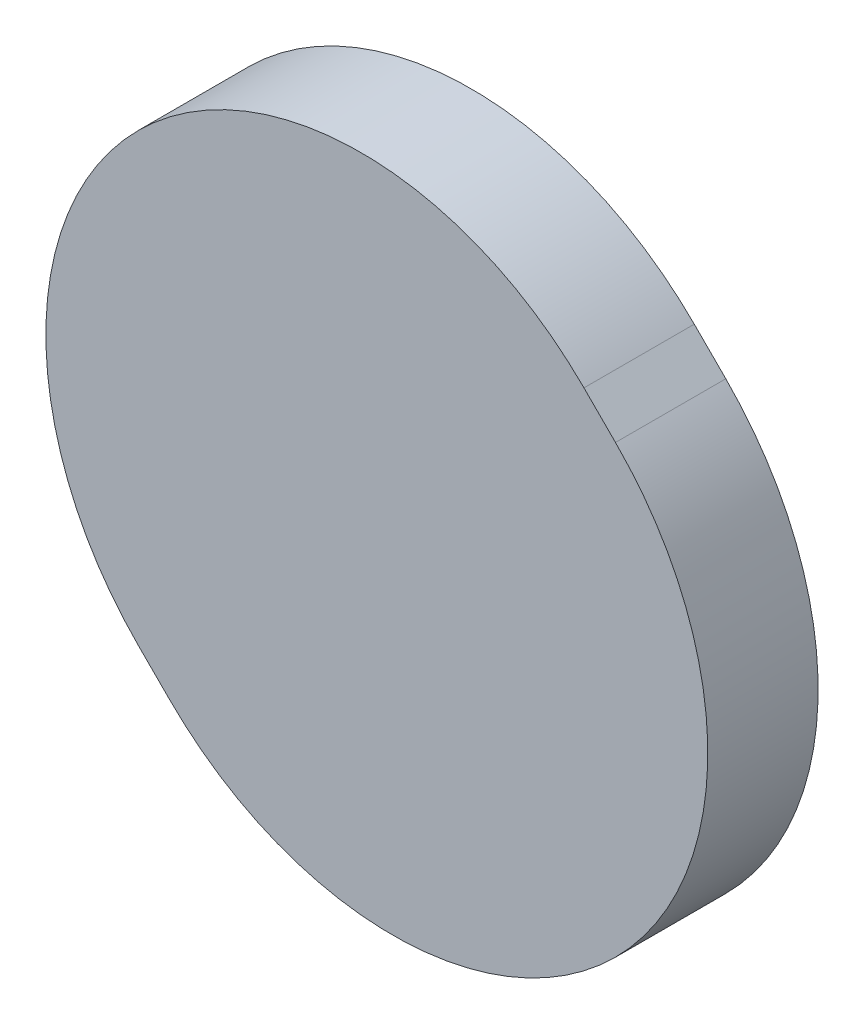
ISO-10303-21;
HEADER;
FILE_DESCRIPTION(('STEP AP214'),'2;1');
FILE_NAME('part.step','',(''),(''),'','','');
FILE_SCHEMA(('AUTOMOTIVE_DESIGN { 1 0 10303 214 1 1 1 1 }'));
ENDSEC;
DATA;
#1=APPLICATION_CONTEXT('core data for automotive mechanical design processes');
#2=APPLICATION_PROTOCOL_DEFINITION('international standard','automotive_design',2000,#1);
#3=PRODUCT_CONTEXT('',#1,'mechanical');
#4=PRODUCT('Part','Part','',(#3));
#5=PRODUCT_RELATED_PRODUCT_CATEGORY('part','',(#4));
#6=PRODUCT_DEFINITION_FORMATION('','',#4);
#7=PRODUCT_DEFINITION_CONTEXT('part definition',#1,'design');
#8=PRODUCT_DEFINITION('design','',#6,#7);
#9=PRODUCT_DEFINITION_SHAPE('','',#8);
#10=(LENGTH_UNIT() NAMED_UNIT(*) SI_UNIT(.MILLI.,.METRE.));
#11=(NAMED_UNIT(*) PLANE_ANGLE_UNIT() SI_UNIT($,.RADIAN.));
#12=(NAMED_UNIT(*) SI_UNIT($,.STERADIAN.) SOLID_ANGLE_UNIT());
#13=UNCERTAINTY_MEASURE_WITH_UNIT(LENGTH_MEASURE(1.E-05),#10,'distance_accuracy_value','');
#14=(GEOMETRIC_REPRESENTATION_CONTEXT(3) GLOBAL_UNCERTAINTY_ASSIGNED_CONTEXT((#13)) GLOBAL_UNIT_ASSIGNED_CONTEXT((#10,
#11,#12)) REPRESENTATION_CONTEXT('',''));
#15=CARTESIAN_POINT('',(0.,0.,0.));
#16=DIRECTION('',(0.,0.,1.));
#17=DIRECTION('',(1.,0.,0.));
#18=AXIS2_PLACEMENT_3D('',#15,#16,#17);
#19=CARTESIAN_POINT('',(83.40071,-102.089289,1.635));
#20=DIRECTION('',(0.,0.,1.));
#21=DIRECTION('',(1.,0.,0.));
#22=AXIS2_PLACEMENT_3D('',#19,#20,#21);
#23=PLANE('',#22);
#24=DIRECTION('',(-0.707106781187048,0.707106781186048,0.));
#25=VECTOR('',#24,1.);
#26=CARTESIAN_POINT('',(83.40071,-102.089289,1.635));
#27=LINE('',#26,#25);
#28=CARTESIAN_POINT('',(83.40071,-102.089289,1.635));
#29=VERTEX_POINT('',#28);
#30=CARTESIAN_POINT('',(83.39071,-102.079289,1.635));
#31=VERTEX_POINT('',#30);
#32=EDGE_CURVE('E82',#29,#31,#27,.T.);
#33=ORIENTED_EDGE('',*,*,#32,.T.);
#34=CARTESIAN_POINT('',(83.3199995,-102.1499995,1.635));
#35=DIRECTION('',(0.,0.,1.));
#36=DIRECTION('',(0.707106781186548,0.707106781186548,0.));
#37=AXIS2_PLACEMENT_3D('',#34,#35,#36);
#38=CIRCLE('',#37,0.09999974810218);
#39=CARTESIAN_POINT('',(83.249289,-102.22071,1.635));
#40=VERTEX_POINT('',#39);
#41=EDGE_CURVE('E98',#31,#40,#38,.T.);
#42=ORIENTED_EDGE('',*,*,#41,.T.);
#43=DIRECTION('',(0.707106781186048,-0.707106781187048,0.));
#44=VECTOR('',#43,1.);
#45=CARTESIAN_POINT('',(83.249289,-102.22071,1.635));
#46=LINE('',#45,#44);
#47=CARTESIAN_POINT('',(83.259289,-102.23071,1.635));
#48=VERTEX_POINT('',#47);
#49=EDGE_CURVE('E75',#40,#48,#46,.T.);
#50=ORIENTED_EDGE('',*,*,#49,.T.);
#51=CARTESIAN_POINT('',(83.3299995,-102.1599995,1.635));
#52=DIRECTION('',(0.,0.,1.));
#53=DIRECTION('',(-0.707106781186548,-0.707106781186548,0.));
#54=AXIS2_PLACEMENT_3D('',#51,#52,#53);
#55=CIRCLE('',#54,0.09999974810219);
#56=EDGE_CURVE('E11',#48,#29,#55,.T.);
#57=ORIENTED_EDGE('',*,*,#56,.T.);
#58=EDGE_LOOP('',(#33,#42,#50,#57));
#59=FACE_BOUND('',#58,.T.);
#60=ADVANCED_FACE('F17',(#59),#23,.T.);
#61=CARTESIAN_POINT('',(83.40071,-102.089289,1.6));
#62=DIRECTION('',(0.,0.,1.));
#63=DIRECTION('',(1.,0.,0.));
#64=AXIS2_PLACEMENT_3D('',#61,#62,#63);
#65=PLANE('',#64);
#66=CARTESIAN_POINT('',(83.3299995,-102.1599995,1.6));
#67=DIRECTION('',(0.,0.,1.));
#68=DIRECTION('',(-0.707106781186548,-0.707106781186548,0.));
#69=AXIS2_PLACEMENT_3D('',#66,#67,#68);
#70=CIRCLE('',#69,0.09999974810219);
#71=CARTESIAN_POINT('',(83.259289,-102.23071,1.6));
#72=VERTEX_POINT('',#71);
#73=CARTESIAN_POINT('',(83.40071,-102.089289,1.6));
#74=VERTEX_POINT('',#73);
#75=EDGE_CURVE('E20',#72,#74,#70,.T.);
#76=ORIENTED_EDGE('',*,*,#75,.F.);
#77=DIRECTION('',(0.707106781186048,-0.707106781187048,0.));
#78=VECTOR('',#77,1.);
#79=CARTESIAN_POINT('',(83.249289,-102.22071,1.6));
#80=LINE('',#79,#78);
#81=CARTESIAN_POINT('',(83.249289,-102.22071,1.6));
#82=VERTEX_POINT('',#81);
#83=EDGE_CURVE('E102',#82,#72,#80,.T.);
#84=ORIENTED_EDGE('',*,*,#83,.F.);
#85=CARTESIAN_POINT('',(83.3199995,-102.1499995,1.6));
#86=DIRECTION('',(0.,0.,1.));
#87=DIRECTION('',(0.707106781186548,0.707106781186548,0.));
#88=AXIS2_PLACEMENT_3D('',#85,#86,#87);
#89=CIRCLE('',#88,0.09999974810218);
#90=CARTESIAN_POINT('',(83.39071,-102.079289,1.6));
#91=VERTEX_POINT('',#90);
#92=EDGE_CURVE('E84',#91,#82,#89,.T.);
#93=ORIENTED_EDGE('',*,*,#92,.F.);
#94=DIRECTION('',(-0.707106781187048,0.707106781186048,0.));
#95=VECTOR('',#94,1.);
#96=CARTESIAN_POINT('',(83.40071,-102.089289,1.6));
#97=LINE('',#96,#95);
#98=EDGE_CURVE('E80',#74,#91,#97,.T.);
#99=ORIENTED_EDGE('',*,*,#98,.F.);
#100=EDGE_LOOP('',(#76,#84,#93,#99));
#101=FACE_BOUND('',#100,.T.);
#102=ADVANCED_FACE('F86',(#101),#65,.F.);
#103=CARTESIAN_POINT('',(83.3299995,-102.1599995,1.6));
#104=DIRECTION('',(0.,0.,-1.));
#105=DIRECTION('',(-0.707106781186548,-0.707106781186548,0.));
#106=AXIS2_PLACEMENT_3D('',#103,#104,#105);
#107=CYLINDRICAL_SURFACE('',#106,0.09999974810219);
#108=ORIENTED_EDGE('',*,*,#75,.T.);
#109=DIRECTION('',(0.,0.,1.));
#110=VECTOR('',#109,1.);
#111=CARTESIAN_POINT('',(83.40071,-102.089289,1.6));
#112=LINE('',#111,#110);
#113=EDGE_CURVE('E69',#74,#29,#112,.T.);
#114=ORIENTED_EDGE('',*,*,#113,.T.);
#115=ORIENTED_EDGE('',*,*,#56,.F.);
#116=DIRECTION('',(0.,0.,1.));
#117=VECTOR('',#116,1.);
#118=CARTESIAN_POINT('',(83.259289,-102.23071,1.6));
#119=LINE('',#118,#117);
#120=EDGE_CURVE('E72',#72,#48,#119,.T.);
#121=ORIENTED_EDGE('',*,*,#120,.F.);
#122=EDGE_LOOP('',(#108,#114,#115,#121));
#123=FACE_BOUND('',#122,.T.);
#124=ADVANCED_FACE('F68',(#123),#107,.T.);
#125=CARTESIAN_POINT('',(83.249289,-102.22071,1.6));
#126=DIRECTION('',(0.707106781187048,0.707106781186048,0.));
#127=DIRECTION('',(0.,0.,-1.));
#128=AXIS2_PLACEMENT_3D('',#125,#126,#127);
#129=PLANE('',#128);
#130=ORIENTED_EDGE('',*,*,#83,.T.);
#131=ORIENTED_EDGE('',*,*,#120,.T.);
#132=ORIENTED_EDGE('',*,*,#49,.F.);
#133=DIRECTION('',(0.,0.,1.));
#134=VECTOR('',#133,1.);
#135=CARTESIAN_POINT('',(83.249289,-102.22071,1.6));
#136=LINE('',#135,#134);
#137=EDGE_CURVE('E103',#82,#40,#136,.T.);
#138=ORIENTED_EDGE('',*,*,#137,.F.);
#139=EDGE_LOOP('',(#130,#131,#132,#138));
#140=FACE_BOUND('',#139,.T.);
#141=ADVANCED_FACE('F120',(#140),#129,.F.);
#142=CARTESIAN_POINT('',(83.3199995,-102.1499995,1.6));
#143=DIRECTION('',(0.,0.,-1.));
#144=DIRECTION('',(0.707106781186548,0.707106781186548,0.));
#145=AXIS2_PLACEMENT_3D('',#142,#143,#144);
#146=CYLINDRICAL_SURFACE('',#145,0.09999974810218);
#147=ORIENTED_EDGE('',*,*,#92,.T.);
#148=ORIENTED_EDGE('',*,*,#137,.T.);
#149=ORIENTED_EDGE('',*,*,#41,.F.);
#150=DIRECTION('',(0.,0.,1.));
#151=VECTOR('',#150,1.);
#152=CARTESIAN_POINT('',(83.39071,-102.079289,1.6));
#153=LINE('',#152,#151);
#154=EDGE_CURVE('E90',#91,#31,#153,.T.);
#155=ORIENTED_EDGE('',*,*,#154,.F.);
#156=EDGE_LOOP('',(#147,#148,#149,#155));
#157=FACE_BOUND('',#156,.T.);
#158=ADVANCED_FACE('F122',(#157),#146,.T.);
#159=CARTESIAN_POINT('',(83.40071,-102.089289,1.6));
#160=DIRECTION('',(-0.707106781186048,-0.707106781187048,0.));
#161=DIRECTION('',(-0.707106781187048,0.707106781186048,0.));
#162=AXIS2_PLACEMENT_3D('',#159,#160,#161);
#163=PLANE('',#162);
#164=ORIENTED_EDGE('',*,*,#98,.T.);
#165=ORIENTED_EDGE('',*,*,#154,.T.);
#166=ORIENTED_EDGE('',*,*,#32,.F.);
#167=ORIENTED_EDGE('',*,*,#113,.F.);
#168=EDGE_LOOP('',(#164,#165,#166,#167));
#169=FACE_BOUND('',#168,.T.);
#170=ADVANCED_FACE('F78',(#169),#163,.F.);
#171=CLOSED_SHELL('',(#60,#102,#124,#141,#158,#170));
#172=MANIFOLD_SOLID_BREP('B1',#171);
#173=ADVANCED_BREP_SHAPE_REPRESENTATION('',(#18,#172),#14);
#174=SHAPE_DEFINITION_REPRESENTATION(#9,#173);
ENDSEC;
END-ISO-10303-21;
